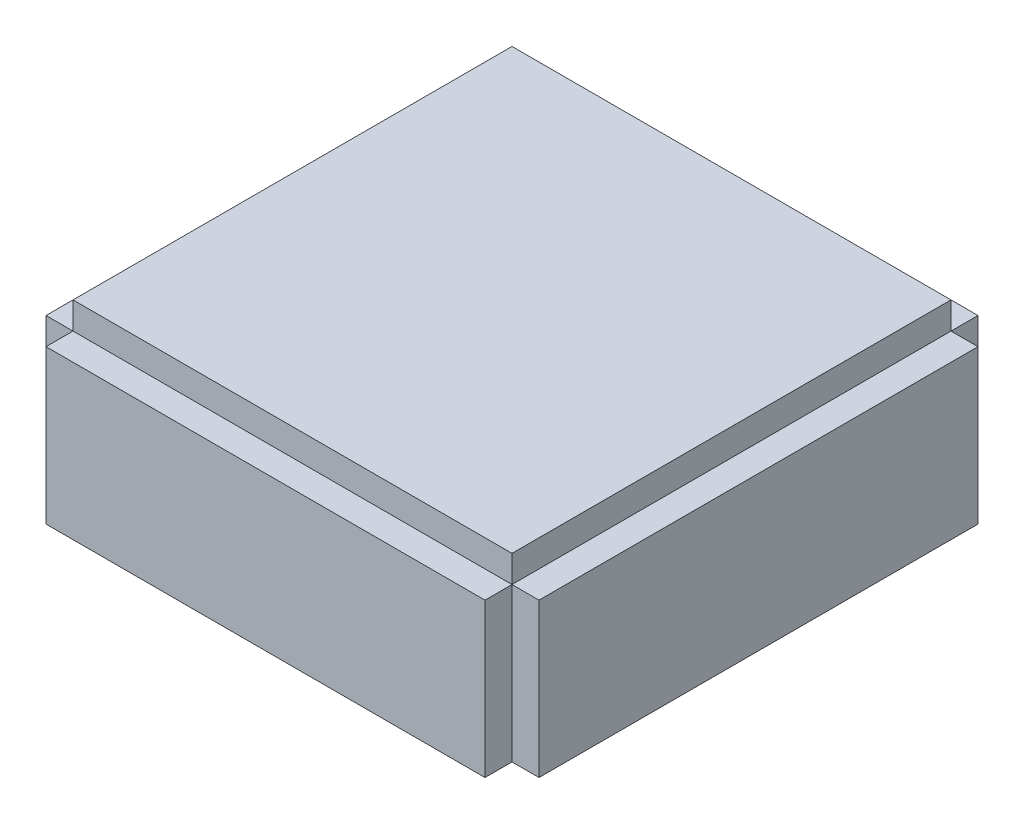
ISO-10303-21;
HEADER;
FILE_DESCRIPTION(('STEP AP214'),'2;1');
FILE_NAME('part.step','',(''),(''),'','','');
FILE_SCHEMA(('AUTOMOTIVE_DESIGN { 1 0 10303 214 1 1 1 1 }'));
ENDSEC;
DATA;
#1=APPLICATION_CONTEXT('core data for automotive mechanical design processes');
#2=APPLICATION_PROTOCOL_DEFINITION('international standard','automotive_design',2000,#1);
#3=PRODUCT_CONTEXT('',#1,'mechanical');
#4=PRODUCT('Part','Part','',(#3));
#5=PRODUCT_RELATED_PRODUCT_CATEGORY('part','',(#4));
#6=PRODUCT_DEFINITION_FORMATION('','',#4);
#7=PRODUCT_DEFINITION_CONTEXT('part definition',#1,'design');
#8=PRODUCT_DEFINITION('design','',#6,#7);
#9=PRODUCT_DEFINITION_SHAPE('','',#8);
#10=(LENGTH_UNIT() NAMED_UNIT(*) SI_UNIT(.MILLI.,.METRE.));
#11=(NAMED_UNIT(*) PLANE_ANGLE_UNIT() SI_UNIT($,.RADIAN.));
#12=(NAMED_UNIT(*) SI_UNIT($,.STERADIAN.) SOLID_ANGLE_UNIT());
#13=UNCERTAINTY_MEASURE_WITH_UNIT(LENGTH_MEASURE(1.E-05),#10,'distance_accuracy_value','');
#14=(GEOMETRIC_REPRESENTATION_CONTEXT(3) GLOBAL_UNCERTAINTY_ASSIGNED_CONTEXT((#13)) GLOBAL_UNIT_ASSIGNED_CONTEXT((#10,
#11,#12)) REPRESENTATION_CONTEXT('',''));
#15=CARTESIAN_POINT('',(0.,0.,0.));
#16=DIRECTION('',(0.,0.,1.));
#17=DIRECTION('',(1.,0.,0.));
#18=AXIS2_PLACEMENT_3D('',#15,#16,#17);
#19=CARTESIAN_POINT('',(0.,-23.114,76.2));
#20=DIRECTION('',(0.,0.,-1.));
#21=DIRECTION('',(-1.,0.,0.));
#22=AXIS2_PLACEMENT_3D('',#19,#20,#21);
#23=PLANE('',#22);
#24=DIRECTION('',(-1.,0.,0.));
#25=VECTOR('',#24,1.);
#26=CARTESIAN_POINT('',(0.,0.,76.2));
#27=LINE('',#26,#25);
#28=CARTESIAN_POINT('',(-2.09799999999999,0.,76.2));
#29=VERTEX_POINT('',#28);
#30=CARTESIAN_POINT('',(-68.138,0.,76.2));
#31=VERTEX_POINT('',#30);
#32=EDGE_CURVE('E110',#29,#31,#27,.T.);
#33=ORIENTED_EDGE('',*,*,#32,.F.);
#34=DIRECTION('',(0.,1.,0.));
#35=VECTOR('',#34,1.);
#36=CARTESIAN_POINT('',(-2.09799999999999,-23.114,76.2));
#37=LINE('',#36,#35);
#38=CARTESIAN_POINT('',(-2.09799999999999,-23.114,76.2));
#39=VERTEX_POINT('',#38);
#40=EDGE_CURVE('E12',#39,#29,#37,.T.);
#41=ORIENTED_EDGE('',*,*,#40,.F.);
#42=DIRECTION('',(-1.,0.,0.));
#43=VECTOR('',#42,1.);
#44=CARTESIAN_POINT('',(0.,-23.114,76.2));
#45=LINE('',#44,#43);
#46=CARTESIAN_POINT('',(-68.138,-23.114,76.2));
#47=VERTEX_POINT('',#46);
#48=EDGE_CURVE('E98',#39,#47,#45,.T.);
#49=ORIENTED_EDGE('',*,*,#48,.T.);
#50=DIRECTION('',(0.,1.,0.));
#51=VECTOR('',#50,1.);
#52=CARTESIAN_POINT('',(-68.138,-23.114,76.2));
#53=LINE('',#52,#51);
#54=EDGE_CURVE('E87',#47,#31,#53,.T.);
#55=ORIENTED_EDGE('',*,*,#54,.T.);
#56=EDGE_LOOP('',(#33,#41,#49,#55));
#57=FACE_BOUND('',#56,.T.);
#58=ADVANCED_FACE('F48',(#57),#23,.T.);
#59=CARTESIAN_POINT('',(-2.09799999999999,-23.114,0.));
#60=DIRECTION('',(-1.,0.,0.));
#61=DIRECTION('',(0.,0.,1.));
#62=AXIS2_PLACEMENT_3D('',#59,#60,#61);
#63=PLANE('',#62);
#64=DIRECTION('',(0.,0.,1.));
#65=VECTOR('',#64,1.);
#66=CARTESIAN_POINT('',(-2.09799999999999,0.,0.));
#67=LINE('',#66,#65);
#68=CARTESIAN_POINT('',(-2.09799999999999,0.,80.2639999999999));
#69=VERTEX_POINT('',#68);
#70=EDGE_CURVE('E103',#29,#69,#67,.T.);
#71=ORIENTED_EDGE('',*,*,#70,.T.);
#72=DIRECTION('',(0.,1.,0.));
#73=VECTOR('',#72,1.);
#74=CARTESIAN_POINT('',(-2.09799999999999,-23.114,80.2639999999999));
#75=LINE('',#74,#73);
#76=CARTESIAN_POINT('',(-2.09799999999999,-23.114,80.2639999999999));
#77=VERTEX_POINT('',#76);
#78=EDGE_CURVE('E56',#77,#69,#75,.T.);
#79=ORIENTED_EDGE('',*,*,#78,.F.);
#80=DIRECTION('',(0.,0.,1.));
#81=VECTOR('',#80,1.);
#82=CARTESIAN_POINT('',(-2.09799999999999,-23.114,0.));
#83=LINE('',#82,#81);
#84=EDGE_CURVE('E93',#39,#77,#83,.T.);
#85=ORIENTED_EDGE('',*,*,#84,.F.);
#86=ORIENTED_EDGE('',*,*,#40,.T.);
#87=EDGE_LOOP('',(#71,#79,#85,#86));
#88=FACE_BOUND('',#87,.T.);
#89=ADVANCED_FACE('F101',(#88),#63,.F.);
#90=CARTESIAN_POINT('',(0.,-23.114,80.264));
#91=DIRECTION('',(0.,0.,-1.));
#92=DIRECTION('',(-1.,0.,0.));
#93=AXIS2_PLACEMENT_3D('',#90,#91,#92);
#94=PLANE('',#93);
#95=DIRECTION('',(-1.,0.,0.));
#96=VECTOR('',#95,1.);
#97=CARTESIAN_POINT('',(0.,0.,80.264));
#98=LINE('',#97,#96);
#99=CARTESIAN_POINT('',(-68.138,0.,80.2639999999999));
#100=VERTEX_POINT('',#99);
#101=EDGE_CURVE('E80',#69,#100,#98,.T.);
#102=ORIENTED_EDGE('',*,*,#101,.T.);
#103=DIRECTION('',(0.,1.,0.));
#104=VECTOR('',#103,1.);
#105=CARTESIAN_POINT('',(-68.138,-23.114,80.2639999999999));
#106=LINE('',#105,#104);
#107=CARTESIAN_POINT('',(-68.138,-23.114,80.2639999999999));
#108=VERTEX_POINT('',#107);
#109=EDGE_CURVE('E104',#108,#100,#106,.T.);
#110=ORIENTED_EDGE('',*,*,#109,.F.);
#111=DIRECTION('',(-1.,0.,0.));
#112=VECTOR('',#111,1.);
#113=CARTESIAN_POINT('',(0.,-23.114,80.264));
#114=LINE('',#113,#112);
#115=EDGE_CURVE('E97',#77,#108,#114,.T.);
#116=ORIENTED_EDGE('',*,*,#115,.F.);
#117=ORIENTED_EDGE('',*,*,#78,.T.);
#118=EDGE_LOOP('',(#102,#110,#116,#117));
#119=FACE_BOUND('',#118,.T.);
#120=ADVANCED_FACE('F105',(#119),#94,.F.);
#121=CARTESIAN_POINT('',(-68.138,-23.114,0.));
#122=DIRECTION('',(1.,0.,0.));
#123=DIRECTION('',(0.,0.,-1.));
#124=AXIS2_PLACEMENT_3D('',#121,#122,#123);
#125=PLANE('',#124);
#126=DIRECTION('',(0.,0.,-1.));
#127=VECTOR('',#126,1.);
#128=CARTESIAN_POINT('',(-68.138,0.,0.));
#129=LINE('',#128,#127);
#130=EDGE_CURVE('E115',#100,#31,#129,.T.);
#131=ORIENTED_EDGE('',*,*,#130,.T.);
#132=ORIENTED_EDGE('',*,*,#54,.F.);
#133=DIRECTION('',(0.,0.,-1.));
#134=VECTOR('',#133,1.);
#135=CARTESIAN_POINT('',(-68.138,-23.114,0.));
#136=LINE('',#135,#134);
#137=EDGE_CURVE('E64',#108,#47,#136,.T.);
#138=ORIENTED_EDGE('',*,*,#137,.F.);
#139=ORIENTED_EDGE('',*,*,#109,.T.);
#140=EDGE_LOOP('',(#131,#132,#138,#139));
#141=FACE_BOUND('',#140,.T.);
#142=ADVANCED_FACE('F120',(#141),#125,.F.);
#143=CARTESIAN_POINT('',(0.,-23.114,0.));
#144=DIRECTION('',(0.,-1.,0.));
#145=DIRECTION('',(0.,0.,-1.));
#146=AXIS2_PLACEMENT_3D('',#143,#144,#145);
#147=PLANE('',#146);
#148=ORIENTED_EDGE('',*,*,#48,.F.);
#149=ORIENTED_EDGE('',*,*,#84,.T.);
#150=ORIENTED_EDGE('',*,*,#115,.T.);
#151=ORIENTED_EDGE('',*,*,#137,.T.);
#152=EDGE_LOOP('',(#148,#149,#150,#151));
#153=FACE_BOUND('',#152,.T.);
#154=ADVANCED_FACE('F95',(#153),#147,.T.);
#155=CARTESIAN_POINT('',(0.,0.,0.));
#156=DIRECTION('',(0.,-1.,0.));
#157=DIRECTION('',(0.,0.,-1.));
#158=AXIS2_PLACEMENT_3D('',#155,#156,#157);
#159=PLANE('',#158);
#160=ORIENTED_EDGE('',*,*,#32,.T.);
#161=ORIENTED_EDGE('',*,*,#130,.F.);
#162=ORIENTED_EDGE('',*,*,#101,.F.);
#163=ORIENTED_EDGE('',*,*,#70,.F.);
#164=EDGE_LOOP('',(#160,#161,#162,#163));
#165=FACE_BOUND('',#164,.T.);
#166=ADVANCED_FACE('F122',(#165),#159,.F.);
#167=CLOSED_SHELL('',(#58,#89,#120,#142,#154,#166));
#168=MANIFOLD_SOLID_BREP('B2',#167);
#169=CARTESIAN_POINT('',(1.9660000000001,-23.114,0.));
#170=DIRECTION('',(1.,0.,0.));
#171=DIRECTION('',(0.,0.,-1.));
#172=AXIS2_PLACEMENT_3D('',#169,#170,#171);
#173=PLANE('',#172);
#174=DIRECTION('',(0.,0.,-1.));
#175=VECTOR('',#174,1.);
#176=CARTESIAN_POINT('',(1.9660000000001,0.,0.));
#177=LINE('',#176,#175);
#178=CARTESIAN_POINT('',(1.96600000000008,0.,146.304));
#179=VERTEX_POINT('',#178);
#180=CARTESIAN_POINT('',(1.96600000000009,0.,80.2639999999999));
#181=VERTEX_POINT('',#180);
#182=EDGE_CURVE('E250',#179,#181,#177,.T.);
#183=ORIENTED_EDGE('',*,*,#182,.F.);
#184=DIRECTION('',(0.,1.,0.));
#185=VECTOR('',#184,1.);
#186=CARTESIAN_POINT('',(1.96600000000008,-23.114,146.304));
#187=LINE('',#186,#185);
#188=CARTESIAN_POINT('',(1.96600000000008,-23.114,146.304));
#189=VERTEX_POINT('',#188);
#190=EDGE_CURVE('E46',#189,#179,#187,.T.);
#191=ORIENTED_EDGE('',*,*,#190,.F.);
#192=DIRECTION('',(0.,0.,-1.));
#193=VECTOR('',#192,1.);
#194=CARTESIAN_POINT('',(1.9660000000001,-23.114,0.));
#195=LINE('',#194,#193);
#196=CARTESIAN_POINT('',(1.96600000000009,-23.114,80.2639999999999));
#197=VERTEX_POINT('',#196);
#198=EDGE_CURVE('E238',#189,#197,#195,.T.);
#199=ORIENTED_EDGE('',*,*,#198,.T.);
#200=DIRECTION('',(0.,1.,0.));
#201=VECTOR('',#200,1.);
#202=CARTESIAN_POINT('',(1.96600000000009,-23.114,80.2639999999999));
#203=LINE('',#202,#201);
#204=EDGE_CURVE('E227',#197,#181,#203,.T.);
#205=ORIENTED_EDGE('',*,*,#204,.T.);
#206=EDGE_LOOP('',(#183,#191,#199,#205));
#207=FACE_BOUND('',#206,.T.);
#208=ADVANCED_FACE('F188',(#207),#173,.T.);
#209=CARTESIAN_POINT('',(-1.75683643457168E-13,-23.114,146.304));
#210=DIRECTION('',(0.,0.,-1.));
#211=DIRECTION('',(-1.,0.,0.));
#212=AXIS2_PLACEMENT_3D('',#209,#210,#211);
#213=PLANE('',#212);
#214=DIRECTION('',(-1.,0.,0.));
#215=VECTOR('',#214,1.);
#216=CARTESIAN_POINT('',(-1.75683643457168E-13,0.,146.304));
#217=LINE('',#216,#215);
#218=CARTESIAN_POINT('',(-2.09799999999999,0.,146.304));
#219=VERTEX_POINT('',#218);
#220=EDGE_CURVE('E243',#179,#219,#217,.T.);
#221=ORIENTED_EDGE('',*,*,#220,.T.);
#222=DIRECTION('',(0.,1.,0.));
#223=VECTOR('',#222,1.);
#224=CARTESIAN_POINT('',(-2.09799999999999,-23.114,146.304));
#225=LINE('',#224,#223);
#226=CARTESIAN_POINT('',(-2.09799999999999,-23.114,146.304));
#227=VERTEX_POINT('',#226);
#228=EDGE_CURVE('E196',#227,#219,#225,.T.);
#229=ORIENTED_EDGE('',*,*,#228,.F.);
#230=DIRECTION('',(-1.,0.,0.));
#231=VECTOR('',#230,1.);
#232=CARTESIAN_POINT('',(-1.75683643457168E-13,-23.114,146.304));
#233=LINE('',#232,#231);
#234=EDGE_CURVE('E233',#189,#227,#233,.T.);
#235=ORIENTED_EDGE('',*,*,#234,.F.);
#236=ORIENTED_EDGE('',*,*,#190,.T.);
#237=EDGE_LOOP('',(#221,#229,#235,#236));
#238=FACE_BOUND('',#237,.T.);
#239=ADVANCED_FACE('F241',(#238),#213,.F.);
#240=CARTESIAN_POINT('',(-2.0979999999999,-23.114,0.));
#241=DIRECTION('',(1.,0.,0.));
#242=DIRECTION('',(0.,0.,-1.));
#243=AXIS2_PLACEMENT_3D('',#240,#241,#242);
#244=PLANE('',#243);
#245=DIRECTION('',(0.,0.,-1.));
#246=VECTOR('',#245,1.);
#247=CARTESIAN_POINT('',(-2.0979999999999,0.,0.));
#248=LINE('',#247,#246);
#249=CARTESIAN_POINT('',(-2.09799999999999,0.,80.2639999999999));
#250=VERTEX_POINT('',#249);
#251=EDGE_CURVE('E220',#219,#250,#248,.T.);
#252=ORIENTED_EDGE('',*,*,#251,.T.);
#253=DIRECTION('',(0.,1.,0.));
#254=VECTOR('',#253,1.);
#255=CARTESIAN_POINT('',(-2.09799999999999,-23.114,80.2639999999999));
#256=LINE('',#255,#254);
#257=CARTESIAN_POINT('',(-2.09799999999999,-23.114,80.2639999999999));
#258=VERTEX_POINT('',#257);
#259=EDGE_CURVE('E244',#258,#250,#256,.T.);
#260=ORIENTED_EDGE('',*,*,#259,.F.);
#261=DIRECTION('',(0.,0.,-1.));
#262=VECTOR('',#261,1.);
#263=CARTESIAN_POINT('',(-2.0979999999999,-23.114,0.));
#264=LINE('',#263,#262);
#265=EDGE_CURVE('E237',#227,#258,#264,.T.);
#266=ORIENTED_EDGE('',*,*,#265,.F.);
#267=ORIENTED_EDGE('',*,*,#228,.T.);
#268=EDGE_LOOP('',(#252,#260,#266,#267));
#269=FACE_BOUND('',#268,.T.);
#270=ADVANCED_FACE('F245',(#269),#244,.F.);
#271=CARTESIAN_POINT('',(0.,-23.114,80.2639999999999));
#272=DIRECTION('',(0.,0.,1.));
#273=DIRECTION('',(1.,0.,0.));
#274=AXIS2_PLACEMENT_3D('',#271,#272,#273);
#275=PLANE('',#274);
#276=DIRECTION('',(1.,0.,0.));
#277=VECTOR('',#276,1.);
#278=CARTESIAN_POINT('',(0.,0.,80.2639999999999));
#279=LINE('',#278,#277);
#280=EDGE_CURVE('E255',#250,#181,#279,.T.);
#281=ORIENTED_EDGE('',*,*,#280,.T.);
#282=ORIENTED_EDGE('',*,*,#204,.F.);
#283=DIRECTION('',(1.,0.,0.));
#284=VECTOR('',#283,1.);
#285=CARTESIAN_POINT('',(0.,-23.114,80.2639999999999));
#286=LINE('',#285,#284);
#287=EDGE_CURVE('E204',#258,#197,#286,.T.);
#288=ORIENTED_EDGE('',*,*,#287,.F.);
#289=ORIENTED_EDGE('',*,*,#259,.T.);
#290=EDGE_LOOP('',(#281,#282,#288,#289));
#291=FACE_BOUND('',#290,.T.);
#292=ADVANCED_FACE('F260',(#291),#275,.F.);
#293=CARTESIAN_POINT('',(0.,-23.114,0.));
#294=DIRECTION('',(0.,-1.,0.));
#295=DIRECTION('',(0.,0.,-1.));
#296=AXIS2_PLACEMENT_3D('',#293,#294,#295);
#297=PLANE('',#296);
#298=ORIENTED_EDGE('',*,*,#198,.F.);
#299=ORIENTED_EDGE('',*,*,#234,.T.);
#300=ORIENTED_EDGE('',*,*,#265,.T.);
#301=ORIENTED_EDGE('',*,*,#287,.T.);
#302=EDGE_LOOP('',(#298,#299,#300,#301));
#303=FACE_BOUND('',#302,.T.);
#304=ADVANCED_FACE('F235',(#303),#297,.T.);
#305=CARTESIAN_POINT('',(0.,0.,0.));
#306=DIRECTION('',(0.,-1.,0.));
#307=DIRECTION('',(0.,0.,-1.));
#308=AXIS2_PLACEMENT_3D('',#305,#306,#307);
#309=PLANE('',#308);
#310=ORIENTED_EDGE('',*,*,#182,.T.);
#311=ORIENTED_EDGE('',*,*,#280,.F.);
#312=ORIENTED_EDGE('',*,*,#251,.F.);
#313=ORIENTED_EDGE('',*,*,#220,.F.);
#314=EDGE_LOOP('',(#310,#311,#312,#313));
#315=FACE_BOUND('',#314,.T.);
#316=ADVANCED_FACE('F262',(#315),#309,.F.);
#317=CLOSED_SHELL('',(#208,#239,#270,#292,#304,#316));
#318=MANIFOLD_SOLID_BREP('B6',#317);
#319=CARTESIAN_POINT('',(0.,-23.114,150.368));
#320=DIRECTION('',(0.,0.,1.));
#321=DIRECTION('',(1.,0.,0.));
#322=AXIS2_PLACEMENT_3D('',#319,#320,#321);
#323=PLANE('',#322);
#324=DIRECTION('',(1.,0.,0.));
#325=VECTOR('',#324,1.);
#326=CARTESIAN_POINT('',(0.,0.,150.368));
#327=LINE('',#326,#325);
#328=CARTESIAN_POINT('',(-68.138,0.,150.368));
#329=VERTEX_POINT('',#328);
#330=CARTESIAN_POINT('',(-2.09799999999999,0.,150.368));
#331=VERTEX_POINT('',#330);
#332=EDGE_CURVE('E390',#329,#331,#327,.T.);
#333=ORIENTED_EDGE('',*,*,#332,.F.);
#334=DIRECTION('',(0.,1.,0.));
#335=VECTOR('',#334,1.);
#336=CARTESIAN_POINT('',(-68.138,-23.114,150.368));
#337=LINE('',#336,#335);
#338=CARTESIAN_POINT('',(-68.138,-23.114,150.368));
#339=VERTEX_POINT('',#338);
#340=EDGE_CURVE('E186',#339,#329,#337,.T.);
#341=ORIENTED_EDGE('',*,*,#340,.F.);
#342=DIRECTION('',(1.,0.,0.));
#343=VECTOR('',#342,1.);
#344=CARTESIAN_POINT('',(0.,-23.114,150.368));
#345=LINE('',#344,#343);
#346=CARTESIAN_POINT('',(-2.09799999999999,-23.114,150.368));
#347=VERTEX_POINT('',#346);
#348=EDGE_CURVE('E378',#339,#347,#345,.T.);
#349=ORIENTED_EDGE('',*,*,#348,.T.);
#350=DIRECTION('',(0.,1.,0.));
#351=VECTOR('',#350,1.);
#352=CARTESIAN_POINT('',(-2.09799999999999,-23.114,150.368));
#353=LINE('',#352,#351);
#354=EDGE_CURVE('E367',#347,#331,#353,.T.);
#355=ORIENTED_EDGE('',*,*,#354,.T.);
#356=EDGE_LOOP('',(#333,#341,#349,#355));
#357=FACE_BOUND('',#356,.T.);
#358=ADVANCED_FACE('F328',(#357),#323,.T.);
#359=CARTESIAN_POINT('',(-68.138,-23.114,0.));
#360=DIRECTION('',(1.,0.,0.));
#361=DIRECTION('',(0.,0.,-1.));
#362=AXIS2_PLACEMENT_3D('',#359,#360,#361);
#363=PLANE('',#362);
#364=DIRECTION('',(0.,0.,-1.));
#365=VECTOR('',#364,1.);
#366=CARTESIAN_POINT('',(-68.138,0.,0.));
#367=LINE('',#366,#365);
#368=CARTESIAN_POINT('',(-68.138,0.,146.304));
#369=VERTEX_POINT('',#368);
#370=EDGE_CURVE('E383',#329,#369,#367,.T.);
#371=ORIENTED_EDGE('',*,*,#370,.T.);
#372=DIRECTION('',(0.,1.,0.));
#373=VECTOR('',#372,1.);
#374=CARTESIAN_POINT('',(-68.138,-23.114,146.304));
#375=LINE('',#374,#373);
#376=CARTESIAN_POINT('',(-68.138,-23.114,146.304));
#377=VERTEX_POINT('',#376);
#378=EDGE_CURVE('E336',#377,#369,#375,.T.);
#379=ORIENTED_EDGE('',*,*,#378,.F.);
#380=DIRECTION('',(0.,0.,-1.));
#381=VECTOR('',#380,1.);
#382=CARTESIAN_POINT('',(-68.138,-23.114,0.));
#383=LINE('',#382,#381);
#384=EDGE_CURVE('E373',#339,#377,#383,.T.);
#385=ORIENTED_EDGE('',*,*,#384,.F.);
#386=ORIENTED_EDGE('',*,*,#340,.T.);
#387=EDGE_LOOP('',(#371,#379,#385,#386));
#388=FACE_BOUND('',#387,.T.);
#389=ADVANCED_FACE('F381',(#388),#363,.F.);
#390=CARTESIAN_POINT('',(0.,-23.114,146.304));
#391=DIRECTION('',(0.,0.,1.));
#392=DIRECTION('',(1.,0.,0.));
#393=AXIS2_PLACEMENT_3D('',#390,#391,#392);
#394=PLANE('',#393);
#395=DIRECTION('',(1.,0.,0.));
#396=VECTOR('',#395,1.);
#397=CARTESIAN_POINT('',(0.,0.,146.304));
#398=LINE('',#397,#396);
#399=CARTESIAN_POINT('',(-2.09799999999999,0.,146.304));
#400=VERTEX_POINT('',#399);
#401=EDGE_CURVE('E360',#369,#400,#398,.T.);
#402=ORIENTED_EDGE('',*,*,#401,.T.);
#403=DIRECTION('',(0.,1.,0.));
#404=VECTOR('',#403,1.);
#405=CARTESIAN_POINT('',(-2.09799999999999,-23.114,146.304));
#406=LINE('',#405,#404);
#407=CARTESIAN_POINT('',(-2.09799999999999,-23.114,146.304));
#408=VERTEX_POINT('',#407);
#409=EDGE_CURVE('E384',#408,#400,#406,.T.);
#410=ORIENTED_EDGE('',*,*,#409,.F.);
#411=DIRECTION('',(1.,0.,0.));
#412=VECTOR('',#411,1.);
#413=CARTESIAN_POINT('',(0.,-23.114,146.304));
#414=LINE('',#413,#412);
#415=EDGE_CURVE('E377',#377,#408,#414,.T.);
#416=ORIENTED_EDGE('',*,*,#415,.F.);
#417=ORIENTED_EDGE('',*,*,#378,.T.);
#418=EDGE_LOOP('',(#402,#410,#416,#417));
#419=FACE_BOUND('',#418,.T.);
#420=ADVANCED_FACE('F385',(#419),#394,.F.);
#421=CARTESIAN_POINT('',(-2.09799999999999,-23.114,0.));
#422=DIRECTION('',(-1.,0.,0.));
#423=DIRECTION('',(0.,0.,1.));
#424=AXIS2_PLACEMENT_3D('',#421,#422,#423);
#425=PLANE('',#424);
#426=DIRECTION('',(0.,0.,1.));
#427=VECTOR('',#426,1.);
#428=CARTESIAN_POINT('',(-2.09799999999999,0.,0.));
#429=LINE('',#428,#427);
#430=EDGE_CURVE('E395',#400,#331,#429,.T.);
#431=ORIENTED_EDGE('',*,*,#430,.T.);
#432=ORIENTED_EDGE('',*,*,#354,.F.);
#433=DIRECTION('',(0.,0.,1.));
#434=VECTOR('',#433,1.);
#435=CARTESIAN_POINT('',(-2.09799999999999,-23.114,0.));
#436=LINE('',#435,#434);
#437=EDGE_CURVE('E344',#408,#347,#436,.T.);
#438=ORIENTED_EDGE('',*,*,#437,.F.);
#439=ORIENTED_EDGE('',*,*,#409,.T.);
#440=EDGE_LOOP('',(#431,#432,#438,#439));
#441=FACE_BOUND('',#440,.T.);
#442=ADVANCED_FACE('F400',(#441),#425,.F.);
#443=CARTESIAN_POINT('',(0.,-23.114,0.));
#444=DIRECTION('',(0.,-1.,0.));
#445=DIRECTION('',(0.,0.,-1.));
#446=AXIS2_PLACEMENT_3D('',#443,#444,#445);
#447=PLANE('',#446);
#448=ORIENTED_EDGE('',*,*,#348,.F.);
#449=ORIENTED_EDGE('',*,*,#384,.T.);
#450=ORIENTED_EDGE('',*,*,#415,.T.);
#451=ORIENTED_EDGE('',*,*,#437,.T.);
#452=EDGE_LOOP('',(#448,#449,#450,#451));
#453=FACE_BOUND('',#452,.T.);
#454=ADVANCED_FACE('F375',(#453),#447,.T.);
#455=CARTESIAN_POINT('',(0.,0.,0.));
#456=DIRECTION('',(0.,-1.,0.));
#457=DIRECTION('',(0.,0.,-1.));
#458=AXIS2_PLACEMENT_3D('',#455,#456,#457);
#459=PLANE('',#458);
#460=ORIENTED_EDGE('',*,*,#332,.T.);
#461=ORIENTED_EDGE('',*,*,#430,.F.);
#462=ORIENTED_EDGE('',*,*,#401,.F.);
#463=ORIENTED_EDGE('',*,*,#370,.F.);
#464=EDGE_LOOP('',(#460,#461,#462,#463));
#465=FACE_BOUND('',#464,.T.);
#466=ADVANCED_FACE('F402',(#465),#459,.F.);
#467=CLOSED_SHELL('',(#358,#389,#420,#442,#454,#466));
#468=MANIFOLD_SOLID_BREP('B40',#467);
#469=CARTESIAN_POINT('',(0.,-23.114,146.304));
#470=DIRECTION('',(0.,0.,-1.));
#471=DIRECTION('',(-1.,0.,0.));
#472=AXIS2_PLACEMENT_3D('',#469,#470,#471);
#473=PLANE('',#472);
#474=DIRECTION('',(-1.,0.,0.));
#475=VECTOR('',#474,1.);
#476=CARTESIAN_POINT('',(0.,0.,146.304));
#477=LINE('',#476,#475);
#478=CARTESIAN_POINT('',(-68.138,0.,146.304));
#479=VERTEX_POINT('',#478);
#480=CARTESIAN_POINT('',(-72.2019999999999,0.,146.304));
#481=VERTEX_POINT('',#480);
#482=EDGE_CURVE('E530',#479,#481,#477,.T.);
#483=ORIENTED_EDGE('',*,*,#482,.T.);
#484=DIRECTION('',(0.,1.,0.));
#485=VECTOR('',#484,1.);
#486=CARTESIAN_POINT('',(-72.2019999999999,-23.114,146.304));
#487=LINE('',#486,#485);
#488=CARTESIAN_POINT('',(-72.2019999999999,-23.114,146.304));
#489=VERTEX_POINT('',#488);
#490=EDGE_CURVE('E326',#489,#481,#487,.T.);
#491=ORIENTED_EDGE('',*,*,#490,.F.);
#492=DIRECTION('',(-1.,0.,0.));
#493=VECTOR('',#492,1.);
#494=CARTESIAN_POINT('',(0.,-23.114,146.304));
#495=LINE('',#494,#493);
#496=CARTESIAN_POINT('',(-68.138,-23.114,146.304));
#497=VERTEX_POINT('',#496);
#498=EDGE_CURVE('E516',#497,#489,#495,.T.);
#499=ORIENTED_EDGE('',*,*,#498,.F.);
#500=DIRECTION('',(0.,1.,0.));
#501=VECTOR('',#500,1.);
#502=CARTESIAN_POINT('',(-68.138,-23.114,146.304));
#503=LINE('',#502,#501);
#504=EDGE_CURVE('E483',#497,#479,#503,.T.);
#505=ORIENTED_EDGE('',*,*,#504,.T.);
#506=EDGE_LOOP('',(#483,#491,#499,#505));
#507=FACE_BOUND('',#506,.T.);
#508=ADVANCED_FACE('F467',(#507),#473,.F.);
#509=CARTESIAN_POINT('',(-72.2019999999999,-23.114,0.));
#510=DIRECTION('',(1.,0.,0.));
#511=DIRECTION('',(0.,0.,-1.));
#512=AXIS2_PLACEMENT_3D('',#509,#510,#511);
#513=PLANE('',#512);
#514=DIRECTION('',(0.,0.,-1.));
#515=VECTOR('',#514,1.);
#516=CARTESIAN_POINT('',(-72.2019999999999,0.,0.));
#517=LINE('',#516,#515);
#518=CARTESIAN_POINT('',(-72.2019999999999,0.,80.2639999999999));
#519=VERTEX_POINT('',#518);
#520=EDGE_CURVE('E521',#481,#519,#517,.T.);
#521=ORIENTED_EDGE('',*,*,#520,.T.);
#522=DIRECTION('',(0.,1.,0.));
#523=VECTOR('',#522,1.);
#524=CARTESIAN_POINT('',(-72.2019999999999,-23.114,80.2639999999999));
#525=LINE('',#524,#523);
#526=CARTESIAN_POINT('',(-72.2019999999999,-23.114,80.2639999999999));
#527=VERTEX_POINT('',#526);
#528=EDGE_CURVE('E475',#527,#519,#525,.T.);
#529=ORIENTED_EDGE('',*,*,#528,.F.);
#530=DIRECTION('',(0.,0.,-1.));
#531=VECTOR('',#530,1.);
#532=CARTESIAN_POINT('',(-72.2019999999999,-23.114,0.));
#533=LINE('',#532,#531);
#534=EDGE_CURVE('E509',#489,#527,#533,.T.);
#535=ORIENTED_EDGE('',*,*,#534,.F.);
#536=ORIENTED_EDGE('',*,*,#490,.T.);
#537=EDGE_LOOP('',(#521,#529,#535,#536));
#538=FACE_BOUND('',#537,.T.);
#539=ADVANCED_FACE('F520',(#538),#513,.F.);
#540=CARTESIAN_POINT('',(0.,-23.114,80.2639999999999));
#541=DIRECTION('',(0.,0.,1.));
#542=DIRECTION('',(1.,0.,0.));
#543=AXIS2_PLACEMENT_3D('',#540,#541,#542);
#544=PLANE('',#543);
#545=DIRECTION('',(1.,0.,0.));
#546=VECTOR('',#545,1.);
#547=CARTESIAN_POINT('',(0.,0.,80.2639999999999));
#548=LINE('',#547,#546);
#549=CARTESIAN_POINT('',(-68.138,0.,80.2639999999999));
#550=VERTEX_POINT('',#549);
#551=EDGE_CURVE('E533',#519,#550,#548,.T.);
#552=ORIENTED_EDGE('',*,*,#551,.T.);
#553=DIRECTION('',(0.,1.,0.));
#554=VECTOR('',#553,1.);
#555=CARTESIAN_POINT('',(-68.138,-23.114,80.2639999999999));
#556=LINE('',#555,#554);
#557=CARTESIAN_POINT('',(-68.138,-23.114,80.2639999999999));
#558=VERTEX_POINT('',#557);
#559=EDGE_CURVE('E498',#558,#550,#556,.T.);
#560=ORIENTED_EDGE('',*,*,#559,.F.);
#561=DIRECTION('',(1.,0.,0.));
#562=VECTOR('',#561,1.);
#563=CARTESIAN_POINT('',(0.,-23.114,80.2639999999999));
#564=LINE('',#563,#562);
#565=EDGE_CURVE('E515',#527,#558,#564,.T.);
#566=ORIENTED_EDGE('',*,*,#565,.F.);
#567=ORIENTED_EDGE('',*,*,#528,.T.);
#568=EDGE_LOOP('',(#552,#560,#566,#567));
#569=FACE_BOUND('',#568,.T.);
#570=ADVANCED_FACE('F524',(#569),#544,.F.);
#571=CARTESIAN_POINT('',(-68.1379999999999,-23.114,0.));
#572=DIRECTION('',(1.,0.,0.));
#573=DIRECTION('',(0.,0.,-1.));
#574=AXIS2_PLACEMENT_3D('',#571,#572,#573);
#575=PLANE('',#574);
#576=DIRECTION('',(0.,0.,-1.));
#577=VECTOR('',#576,1.);
#578=CARTESIAN_POINT('',(-68.1379999999999,0.,0.));
#579=LINE('',#578,#577);
#580=EDGE_CURVE('E535',#479,#550,#579,.T.);
#581=ORIENTED_EDGE('',*,*,#580,.F.);
#582=ORIENTED_EDGE('',*,*,#504,.F.);
#583=DIRECTION('',(0.,0.,-1.));
#584=VECTOR('',#583,1.);
#585=CARTESIAN_POINT('',(-68.1379999999999,-23.114,0.));
#586=LINE('',#585,#584);
#587=EDGE_CURVE('E525',#497,#558,#586,.T.);
#588=ORIENTED_EDGE('',*,*,#587,.T.);
#589=ORIENTED_EDGE('',*,*,#559,.T.);
#590=EDGE_LOOP('',(#581,#582,#588,#589));
#591=FACE_BOUND('',#590,.T.);
#592=ADVANCED_FACE('F541',(#591),#575,.T.);
#593=CARTESIAN_POINT('',(0.,-23.114,0.));
#594=DIRECTION('',(0.,-1.,0.));
#595=DIRECTION('',(0.,0.,-1.));
#596=AXIS2_PLACEMENT_3D('',#593,#594,#595);
#597=PLANE('',#596);
#598=ORIENTED_EDGE('',*,*,#498,.T.);
#599=ORIENTED_EDGE('',*,*,#534,.T.);
#600=ORIENTED_EDGE('',*,*,#565,.T.);
#601=ORIENTED_EDGE('',*,*,#587,.F.);
#602=EDGE_LOOP('',(#598,#599,#600,#601));
#603=FACE_BOUND('',#602,.T.);
#604=ADVANCED_FACE('F512',(#603),#597,.T.);
#605=CARTESIAN_POINT('',(0.,0.,0.));
#606=DIRECTION('',(0.,-1.,0.));
#607=DIRECTION('',(0.,0.,-1.));
#608=AXIS2_PLACEMENT_3D('',#605,#606,#607);
#609=PLANE('',#608);
#610=ORIENTED_EDGE('',*,*,#482,.F.);
#611=ORIENTED_EDGE('',*,*,#580,.T.);
#612=ORIENTED_EDGE('',*,*,#551,.F.);
#613=ORIENTED_EDGE('',*,*,#520,.F.);
#614=EDGE_LOOP('',(#610,#611,#612,#613));
#615=FACE_BOUND('',#614,.T.);
#616=ADVANCED_FACE('F540',(#615),#609,.F.);
#617=CLOSED_SHELL('',(#508,#539,#570,#592,#604,#616));
#618=MANIFOLD_SOLID_BREP('B180',#617);
#619=CARTESIAN_POINT('',(0.,4.064,0.));
#620=DIRECTION('',(0.,-1.,0.));
#621=DIRECTION('',(0.,0.,-1.));
#622=AXIS2_PLACEMENT_3D('',#619,#620,#621);
#623=PLANE('',#622);
#624=DIRECTION('',(0.,0.,-1.));
#625=VECTOR('',#624,1.);
#626=CARTESIAN_POINT('',(-2.09799999999999,4.064,0.));
#627=LINE('',#626,#625);
#628=CARTESIAN_POINT('',(-2.09799999999999,4.064,146.304));
#629=VERTEX_POINT('',#628);
#630=CARTESIAN_POINT('',(-2.09799999999999,4.064,80.2639999999999));
#631=VERTEX_POINT('',#630);
#632=EDGE_CURVE('E610',#629,#631,#627,.T.);
#633=ORIENTED_EDGE('',*,*,#632,.T.);
#634=DIRECTION('',(-1.,0.,0.));
#635=VECTOR('',#634,1.);
#636=CARTESIAN_POINT('',(-2.09799999999999,4.064,80.2639999999999));
#637=LINE('',#636,#635);
#638=CARTESIAN_POINT('',(-68.138,4.064,80.2639999999999));
#639=VERTEX_POINT('',#638);
#640=EDGE_CURVE('E646',#631,#639,#637,.T.);
#641=ORIENTED_EDGE('',*,*,#640,.T.);
#642=DIRECTION('',(0.,0.,-1.));
#643=VECTOR('',#642,1.);
#644=CARTESIAN_POINT('',(-68.138,4.064,0.));
#645=LINE('',#644,#643);
#646=CARTESIAN_POINT('',(-68.138,4.064,146.304));
#647=VERTEX_POINT('',#646);
#648=EDGE_CURVE('E666',#647,#639,#645,.T.);
#649=ORIENTED_EDGE('',*,*,#648,.F.);
#650=DIRECTION('',(1.,0.,0.));
#651=VECTOR('',#650,1.);
#652=CARTESIAN_POINT('',(21.016,4.064,146.304));
#653=LINE('',#652,#651);
#654=EDGE_CURVE('E649',#647,#629,#653,.T.);
#655=ORIENTED_EDGE('',*,*,#654,.T.);
#656=EDGE_LOOP('',(#633,#641,#649,#655));
#657=FACE_BOUND('',#656,.T.);
#658=ADVANCED_FACE('F596',(#657),#623,.F.);
#659=CARTESIAN_POINT('',(0.,0.,0.));
#660=DIRECTION('',(0.,-1.,0.));
#661=DIRECTION('',(0.,0.,-1.));
#662=AXIS2_PLACEMENT_3D('',#659,#660,#661);
#663=PLANE('',#662);
#664=DIRECTION('',(-1.,0.,0.));
#665=VECTOR('',#664,1.);
#666=CARTESIAN_POINT('',(-68.138,0.,80.2639999999999));
#667=LINE('',#666,#665);
#668=CARTESIAN_POINT('',(-2.09799999999999,0.,80.2639999999999));
#669=VERTEX_POINT('',#668);
#670=CARTESIAN_POINT('',(-68.138,0.,80.2639999999999));
#671=VERTEX_POINT('',#670);
#672=EDGE_CURVE('E658',#669,#671,#667,.T.);
#673=ORIENTED_EDGE('',*,*,#672,.F.);
#674=DIRECTION('',(0.,0.,1.));
#675=VECTOR('',#674,1.);
#676=CARTESIAN_POINT('',(-2.09799999999999,0.,0.));
#677=LINE('',#676,#675);
#678=CARTESIAN_POINT('',(-2.09799999999999,0.,146.304));
#679=VERTEX_POINT('',#678);
#680=EDGE_CURVE('E638',#669,#679,#677,.T.);
#681=ORIENTED_EDGE('',*,*,#680,.T.);
#682=DIRECTION('',(1.,0.,0.));
#683=VECTOR('',#682,1.);
#684=CARTESIAN_POINT('',(-91.2519999999998,0.,146.304));
#685=LINE('',#684,#683);
#686=CARTESIAN_POINT('',(-68.138,0.,146.304));
#687=VERTEX_POINT('',#686);
#688=EDGE_CURVE('E654',#687,#679,#685,.T.);
#689=ORIENTED_EDGE('',*,*,#688,.F.);
#690=DIRECTION('',(0.,0.,1.));
#691=VECTOR('',#690,1.);
#692=CARTESIAN_POINT('',(-68.138,0.,0.));
#693=LINE('',#692,#691);
#694=EDGE_CURVE('E618',#671,#687,#693,.T.);
#695=ORIENTED_EDGE('',*,*,#694,.F.);
#696=EDGE_LOOP('',(#673,#681,#689,#695));
#697=FACE_BOUND('',#696,.T.);
#698=ADVANCED_FACE('F665',(#697),#663,.T.);
#699=CARTESIAN_POINT('',(-68.138,4.064,80.2639999999999));
#700=DIRECTION('',(0.,0.,1.));
#701=DIRECTION('',(1.,0.,0.));
#702=AXIS2_PLACEMENT_3D('',#699,#700,#701);
#703=PLANE('',#702);
#704=DIRECTION('',(0.,1.,0.));
#705=VECTOR('',#704,1.);
#706=CARTESIAN_POINT('',(-2.09799999999999,-0.254,80.2639999999999));
#707=LINE('',#706,#705);
#708=EDGE_CURVE('E635',#669,#631,#707,.T.);
#709=ORIENTED_EDGE('',*,*,#708,.F.);
#710=ORIENTED_EDGE('',*,*,#672,.T.);
#711=DIRECTION('',(0.,1.,0.));
#712=VECTOR('',#711,1.);
#713=CARTESIAN_POINT('',(-68.138,-0.254,80.2639999999999));
#714=LINE('',#713,#712);
#715=EDGE_CURVE('E652',#671,#639,#714,.T.);
#716=ORIENTED_EDGE('',*,*,#715,.T.);
#717=ORIENTED_EDGE('',*,*,#640,.F.);
#718=EDGE_LOOP('',(#709,#710,#716,#717));
#719=FACE_BOUND('',#718,.T.);
#720=ADVANCED_FACE('F598',(#719),#703,.F.);
#721=CARTESIAN_POINT('',(-91.2519999999998,4.064,146.304));
#722=DIRECTION('',(0.,0.,-1.));
#723=DIRECTION('',(-1.,0.,0.));
#724=AXIS2_PLACEMENT_3D('',#721,#722,#723);
#725=PLANE('',#724);
#726=DIRECTION('',(0.,-1.,0.));
#727=VECTOR('',#726,1.);
#728=CARTESIAN_POINT('',(-2.09799999999999,4.064,146.304));
#729=LINE('',#728,#727);
#730=EDGE_CURVE('E465',#629,#679,#729,.T.);
#731=ORIENTED_EDGE('',*,*,#730,.F.);
#732=ORIENTED_EDGE('',*,*,#654,.F.);
#733=DIRECTION('',(0.,-1.,0.));
#734=VECTOR('',#733,1.);
#735=CARTESIAN_POINT('',(-68.138,4.064,146.304));
#736=LINE('',#735,#734);
#737=EDGE_CURVE('E604',#647,#687,#736,.T.);
#738=ORIENTED_EDGE('',*,*,#737,.T.);
#739=ORIENTED_EDGE('',*,*,#688,.T.);
#740=EDGE_LOOP('',(#731,#732,#738,#739));
#741=FACE_BOUND('',#740,.T.);
#742=ADVANCED_FACE('F663',(#741),#725,.F.);
#743=CARTESIAN_POINT('',(-68.138,-0.254,0.));
#744=DIRECTION('',(1.,0.,0.));
#745=DIRECTION('',(0.,0.,-1.));
#746=AXIS2_PLACEMENT_3D('',#743,#744,#745);
#747=PLANE('',#746);
#748=ORIENTED_EDGE('',*,*,#694,.T.);
#749=ORIENTED_EDGE('',*,*,#737,.F.);
#750=ORIENTED_EDGE('',*,*,#648,.T.);
#751=ORIENTED_EDGE('',*,*,#715,.F.);
#752=EDGE_LOOP('',(#748,#749,#750,#751));
#753=FACE_BOUND('',#752,.T.);
#754=ADVANCED_FACE('F670',(#753),#747,.F.);
#755=CARTESIAN_POINT('',(-2.09799999999999,-0.254,0.));
#756=DIRECTION('',(1.,0.,0.));
#757=DIRECTION('',(0.,0.,-1.));
#758=AXIS2_PLACEMENT_3D('',#755,#756,#757);
#759=PLANE('',#758);
#760=ORIENTED_EDGE('',*,*,#708,.T.);
#761=ORIENTED_EDGE('',*,*,#632,.F.);
#762=ORIENTED_EDGE('',*,*,#730,.T.);
#763=ORIENTED_EDGE('',*,*,#680,.F.);
#764=EDGE_LOOP('',(#760,#761,#762,#763));
#765=FACE_BOUND('',#764,.T.);
#766=ADVANCED_FACE('F636',(#765),#759,.T.);
#767=CLOSED_SHELL('',(#658,#698,#720,#742,#754,#766));
#768=MANIFOLD_SOLID_BREP('B320',#767);
#769=ADVANCED_BREP_SHAPE_REPRESENTATION('',(#18,#168,#318,#468,#618,#768),#14);
#770=SHAPE_DEFINITION_REPRESENTATION(#9,#769);
ENDSEC;
END-ISO-10303-21;
